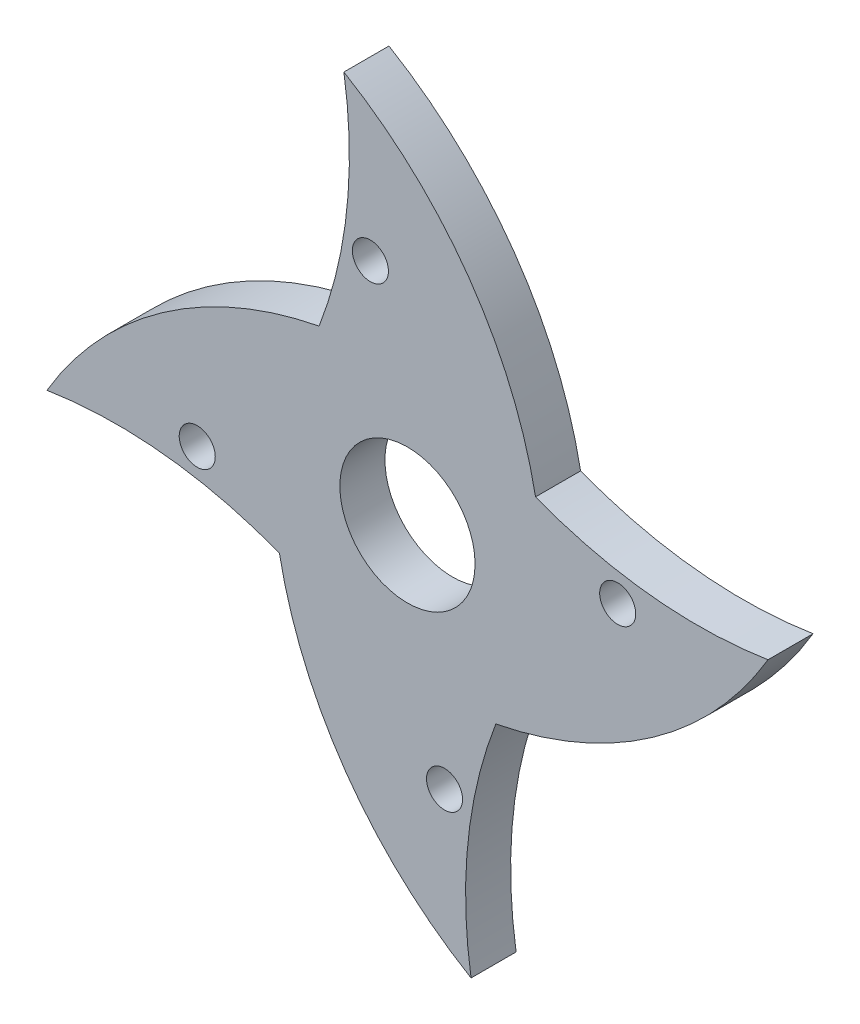
ISO-10303-21;
HEADER;
FILE_DESCRIPTION(('STEP AP214'),'2;1');
FILE_NAME('part.step','',(''),(''),'','','');
FILE_SCHEMA(('AUTOMOTIVE_DESIGN { 1 0 10303 214 1 1 1 1 }'));
ENDSEC;
DATA;
#1=APPLICATION_CONTEXT('core data for automotive mechanical design processes');
#2=APPLICATION_PROTOCOL_DEFINITION('international standard','automotive_design',2000,#1);
#3=PRODUCT_CONTEXT('',#1,'mechanical');
#4=PRODUCT('Part','Part','',(#3));
#5=PRODUCT_RELATED_PRODUCT_CATEGORY('part','',(#4));
#6=PRODUCT_DEFINITION_FORMATION('','',#4);
#7=PRODUCT_DEFINITION_CONTEXT('part definition',#1,'design');
#8=PRODUCT_DEFINITION('design','',#6,#7);
#9=PRODUCT_DEFINITION_SHAPE('','',#8);
#10=(LENGTH_UNIT() NAMED_UNIT(*) SI_UNIT(.MILLI.,.METRE.));
#11=(NAMED_UNIT(*) PLANE_ANGLE_UNIT() SI_UNIT($,.RADIAN.));
#12=(NAMED_UNIT(*) SI_UNIT($,.STERADIAN.) SOLID_ANGLE_UNIT());
#13=UNCERTAINTY_MEASURE_WITH_UNIT(LENGTH_MEASURE(1.E-05),#10,'distance_accuracy_value','');
#14=(GEOMETRIC_REPRESENTATION_CONTEXT(3) GLOBAL_UNCERTAINTY_ASSIGNED_CONTEXT((#13)) GLOBAL_UNIT_ASSIGNED_CONTEXT((#10,
#11,#12)) REPRESENTATION_CONTEXT('',''));
#15=CARTESIAN_POINT('',(0.,0.,0.));
#16=DIRECTION('',(0.,0.,1.));
#17=DIRECTION('',(1.,0.,0.));
#18=AXIS2_PLACEMENT_3D('',#15,#16,#17);
#19=CARTESIAN_POINT('',(-2.55003220114598,-59.9483059626185,10.));
#20=DIRECTION('',(0.,0.,-1.));
#21=DIRECTION('',(-1.,0.,0.));
#22=AXIS2_PLACEMENT_3D('',#19,#20,#21);
#23=CYLINDRICAL_SURFACE('',#22,90.0000000000019);
#24=CARTESIAN_POINT('',(-2.55003220114598,-59.9483059626185,0.));
#25=DIRECTION('',(0.,0.,1.));
#26=DIRECTION('',(1.,0.,0.));
#27=AXIS2_PLACEMENT_3D('',#24,#25,#26);
#28=CIRCLE('',#27,90.0000000000019);
#29=CARTESIAN_POINT('',(-80.0000000000034,-14.1061584566794,0.));
#30=VERTEX_POINT('',#29);
#31=CARTESIAN_POINT('',(-19.61,28.42,0.));
#32=VERTEX_POINT('',#31);
#33=EDGE_CURVE('E146',#30,#32,#28,.F.);
#34=ORIENTED_EDGE('',*,*,#33,.F.);
#35=DIRECTION('',(0.,0.,-1.));
#36=VECTOR('',#35,1.);
#37=CARTESIAN_POINT('',(-80.0000000000034,-14.1061584566794,10.));
#38=LINE('',#37,#36);
#39=CARTESIAN_POINT('',(-80.0000000000034,-14.1061584566794,10.));
#40=VERTEX_POINT('',#39);
#41=EDGE_CURVE('E11',#40,#30,#38,.T.);
#42=ORIENTED_EDGE('',*,*,#41,.F.);
#43=CARTESIAN_POINT('',(-2.55003220114598,-59.9483059626185,10.));
#44=DIRECTION('',(0.,0.,1.));
#45=DIRECTION('',(1.,0.,0.));
#46=AXIS2_PLACEMENT_3D('',#43,#44,#45);
#47=CIRCLE('',#46,90.0000000000019);
#48=CARTESIAN_POINT('',(-19.61,28.42,10.));
#49=VERTEX_POINT('',#48);
#50=EDGE_CURVE('E199',#40,#49,#47,.F.);
#51=ORIENTED_EDGE('',*,*,#50,.T.);
#52=DIRECTION('',(0.,0.,-1.));
#53=VECTOR('',#52,1.);
#54=CARTESIAN_POINT('',(-19.61,28.42,10.));
#55=LINE('',#54,#53);
#56=EDGE_CURVE('E87',#49,#32,#55,.T.);
#57=ORIENTED_EDGE('',*,*,#56,.T.);
#58=EDGE_LOOP('',(#34,#42,#51,#57));
#59=FACE_BOUND('',#58,.T.);
#60=ADVANCED_FACE('F36',(#59),#23,.T.);
#61=CARTESIAN_POINT('',(-64.4571752889624,-112.890876910508,10.));
#62=DIRECTION('',(0.,0.,-1.));
#63=DIRECTION('',(-1.,0.,0.));
#64=AXIS2_PLACEMENT_3D('',#61,#62,#63);
#65=CYLINDRICAL_SURFACE('',#64,99.9999999999988);
#66=CARTESIAN_POINT('',(-64.4571752889624,-112.890876910508,0.));
#67=DIRECTION('',(0.,0.,1.));
#68=DIRECTION('',(1.,0.,0.));
#69=AXIS2_PLACEMENT_3D('',#66,#67,#68);
#70=CIRCLE('',#69,99.9999999999988);
#71=CARTESIAN_POINT('',(-28.4200000000007,-19.6100000000053,0.));
#72=VERTEX_POINT('',#71);
#73=EDGE_CURVE('E149',#30,#72,#70,.F.);
#74=ORIENTED_EDGE('',*,*,#73,.T.);
#75=DIRECTION('',(0.,0.,-1.));
#76=VECTOR('',#75,1.);
#77=CARTESIAN_POINT('',(-28.4200000000007,-19.6100000000053,10.));
#78=LINE('',#77,#76);
#79=CARTESIAN_POINT('',(-28.4200000000007,-19.6100000000053,10.));
#80=VERTEX_POINT('',#79);
#81=EDGE_CURVE('E45',#80,#72,#78,.T.);
#82=ORIENTED_EDGE('',*,*,#81,.F.);
#83=CARTESIAN_POINT('',(-64.4571752889624,-112.890876910508,10.));
#84=DIRECTION('',(0.,0.,1.));
#85=DIRECTION('',(1.,0.,0.));
#86=AXIS2_PLACEMENT_3D('',#83,#84,#85);
#87=CIRCLE('',#86,99.9999999999988);
#88=EDGE_CURVE('E197',#40,#80,#87,.F.);
#89=ORIENTED_EDGE('',*,*,#88,.F.);
#90=ORIENTED_EDGE('',*,*,#41,.T.);
#91=EDGE_LOOP('',(#74,#82,#89,#90));
#92=FACE_BOUND('',#91,.T.);
#93=ADVANCED_FACE('F185',(#92),#65,.F.);
#94=CARTESIAN_POINT('',(59.9483059626154,-2.55003220115169,10.));
#95=DIRECTION('',(0.,0.,-1.));
#96=DIRECTION('',(-1.,0.,0.));
#97=AXIS2_PLACEMENT_3D('',#94,#95,#96);
#98=CYLINDRICAL_SURFACE('',#97,90.0000000000025);
#99=CARTESIAN_POINT('',(59.9483059626154,-2.55003220115169,0.));
#100=DIRECTION('',(0.,0.,1.));
#101=DIRECTION('',(1.,0.,0.));
#102=AXIS2_PLACEMENT_3D('',#99,#100,#101);
#103=CIRCLE('',#102,90.0000000000025);
#104=CARTESIAN_POINT('',(14.1061584566783,-80.000000000011,0.));
#105=VERTEX_POINT('',#104);
#106=EDGE_CURVE('E152',#105,#72,#103,.F.);
#107=ORIENTED_EDGE('',*,*,#106,.F.);
#108=DIRECTION('',(0.,0.,-1.));
#109=VECTOR('',#108,1.);
#110=CARTESIAN_POINT('',(14.1061584566783,-80.000000000011,10.));
#111=LINE('',#110,#109);
#112=CARTESIAN_POINT('',(14.1061584566783,-80.000000000011,10.));
#113=VERTEX_POINT('',#112);
#114=EDGE_CURVE('E175',#113,#105,#111,.T.);
#115=ORIENTED_EDGE('',*,*,#114,.F.);
#116=CARTESIAN_POINT('',(59.9483059626154,-2.55003220115169,10.));
#117=DIRECTION('',(0.,0.,1.));
#118=DIRECTION('',(1.,0.,0.));
#119=AXIS2_PLACEMENT_3D('',#116,#117,#118);
#120=CIRCLE('',#119,90.0000000000025);
#121=EDGE_CURVE('E182',#113,#80,#120,.F.);
#122=ORIENTED_EDGE('',*,*,#121,.T.);
#123=ORIENTED_EDGE('',*,*,#81,.T.);
#124=EDGE_LOOP('',(#107,#115,#122,#123));
#125=FACE_BOUND('',#124,.T.);
#126=ADVANCED_FACE('F180',(#125),#98,.T.);
#127=CARTESIAN_POINT('',(112.890876910507,-64.4571752889705,10.));
#128=DIRECTION('',(0.,0.,-1.));
#129=DIRECTION('',(-1.,0.,0.));
#130=AXIS2_PLACEMENT_3D('',#127,#128,#129);
#131=CYLINDRICAL_SURFACE('',#130,100.000000000003);
#132=CARTESIAN_POINT('',(112.890876910507,-64.4571752889705,0.));
#133=DIRECTION('',(0.,0.,1.));
#134=DIRECTION('',(1.,0.,0.));
#135=AXIS2_PLACEMENT_3D('',#132,#133,#134);
#136=CIRCLE('',#135,100.000000000003);
#137=CARTESIAN_POINT('',(19.6100000000004,-28.420000000002,0.));
#138=VERTEX_POINT('',#137);
#139=EDGE_CURVE('E155',#105,#138,#136,.F.);
#140=ORIENTED_EDGE('',*,*,#139,.T.);
#141=DIRECTION('',(0.,0.,-1.));
#142=VECTOR('',#141,1.);
#143=CARTESIAN_POINT('',(19.6100000000004,-28.420000000002,10.));
#144=LINE('',#143,#142);
#145=CARTESIAN_POINT('',(19.6100000000004,-28.420000000002,10.));
#146=VERTEX_POINT('',#145);
#147=EDGE_CURVE('E173',#146,#138,#144,.T.);
#148=ORIENTED_EDGE('',*,*,#147,.F.);
#149=CARTESIAN_POINT('',(112.890876910507,-64.4571752889705,10.));
#150=DIRECTION('',(0.,0.,1.));
#151=DIRECTION('',(1.,0.,0.));
#152=AXIS2_PLACEMENT_3D('',#149,#150,#151);
#153=CIRCLE('',#152,100.000000000003);
#154=EDGE_CURVE('E195',#113,#146,#153,.F.);
#155=ORIENTED_EDGE('',*,*,#154,.F.);
#156=ORIENTED_EDGE('',*,*,#114,.T.);
#157=EDGE_LOOP('',(#140,#148,#155,#156));
#158=FACE_BOUND('',#157,.T.);
#159=ADVANCED_FACE('F193',(#158),#131,.F.);
#160=CARTESIAN_POINT('',(2.55003220114852,59.9483059626096,10.));
#161=DIRECTION('',(0.,0.,-1.));
#162=DIRECTION('',(-1.,0.,0.));
#163=AXIS2_PLACEMENT_3D('',#160,#161,#162);
#164=CYLINDRICAL_SURFACE('',#163,89.9999999999979);
#165=CARTESIAN_POINT('',(2.55003220114852,59.9483059626096,0.));
#166=DIRECTION('',(0.,0.,1.));
#167=DIRECTION('',(1.,0.,0.));
#168=AXIS2_PLACEMENT_3D('',#165,#166,#167);
#169=CIRCLE('',#168,89.9999999999979);
#170=CARTESIAN_POINT('',(80.0000000000039,14.1061584566749,0.));
#171=VERTEX_POINT('',#170);
#172=EDGE_CURVE('E158',#171,#138,#169,.F.);
#173=ORIENTED_EDGE('',*,*,#172,.F.);
#174=DIRECTION('',(0.,0.,-1.));
#175=VECTOR('',#174,1.);
#176=CARTESIAN_POINT('',(80.0000000000039,14.1061584566749,10.));
#177=LINE('',#176,#175);
#178=CARTESIAN_POINT('',(80.0000000000039,14.1061584566749,10.));
#179=VERTEX_POINT('',#178);
#180=EDGE_CURVE('E124',#179,#171,#177,.T.);
#181=ORIENTED_EDGE('',*,*,#180,.F.);
#182=CARTESIAN_POINT('',(2.55003220114852,59.9483059626096,10.));
#183=DIRECTION('',(0.,0.,1.));
#184=DIRECTION('',(1.,0.,0.));
#185=AXIS2_PLACEMENT_3D('',#182,#183,#184);
#186=CIRCLE('',#185,89.9999999999979);
#187=EDGE_CURVE('E113',#179,#146,#186,.F.);
#188=ORIENTED_EDGE('',*,*,#187,.T.);
#189=ORIENTED_EDGE('',*,*,#147,.T.);
#190=EDGE_LOOP('',(#173,#181,#188,#189));
#191=FACE_BOUND('',#190,.T.);
#192=ADVANCED_FACE('F203',(#191),#164,.T.);
#193=CARTESIAN_POINT('',(64.4571752889649,112.890876910499,10.));
#194=DIRECTION('',(0.,0.,-1.));
#195=DIRECTION('',(-1.,0.,0.));
#196=AXIS2_PLACEMENT_3D('',#193,#194,#195);
#197=CYLINDRICAL_SURFACE('',#196,99.9999999999977);
#198=CARTESIAN_POINT('',(64.4571752889649,112.890876910499,0.));
#199=DIRECTION('',(0.,0.,1.));
#200=DIRECTION('',(1.,0.,0.));
#201=AXIS2_PLACEMENT_3D('',#198,#199,#200);
#202=CIRCLE('',#201,99.9999999999977);
#203=CARTESIAN_POINT('',(28.42,19.61,0.));
#204=VERTEX_POINT('',#203);
#205=EDGE_CURVE('E120',#171,#204,#202,.F.);
#206=ORIENTED_EDGE('',*,*,#205,.T.);
#207=DIRECTION('',(0.,0.,-1.));
#208=VECTOR('',#207,1.);
#209=CARTESIAN_POINT('',(28.42,19.61,10.));
#210=LINE('',#209,#208);
#211=CARTESIAN_POINT('',(28.42,19.61,10.));
#212=VERTEX_POINT('',#211);
#213=EDGE_CURVE('E117',#212,#204,#210,.T.);
#214=ORIENTED_EDGE('',*,*,#213,.F.);
#215=CARTESIAN_POINT('',(64.4571752889649,112.890876910499,10.));
#216=DIRECTION('',(0.,0.,1.));
#217=DIRECTION('',(1.,0.,0.));
#218=AXIS2_PLACEMENT_3D('',#215,#216,#217);
#219=CIRCLE('',#218,99.9999999999977);
#220=EDGE_CURVE('E106',#179,#212,#219,.F.);
#221=ORIENTED_EDGE('',*,*,#220,.F.);
#222=ORIENTED_EDGE('',*,*,#180,.T.);
#223=EDGE_LOOP('',(#206,#214,#221,#222));
#224=FACE_BOUND('',#223,.T.);
#225=ADVANCED_FACE('F118',(#224),#197,.F.);
#226=CARTESIAN_POINT('',(-59.9483059626128,2.5500322011428,10.));
#227=DIRECTION('',(0.,0.,-1.));
#228=DIRECTION('',(-1.,0.,0.));
#229=AXIS2_PLACEMENT_3D('',#226,#227,#228);
#230=CYLINDRICAL_SURFACE('',#229,90.);
#231=CARTESIAN_POINT('',(-59.9483059626128,2.5500322011428,0.));
#232=DIRECTION('',(0.,0.,1.));
#233=DIRECTION('',(1.,0.,0.));
#234=AXIS2_PLACEMENT_3D('',#231,#232,#233);
#235=CIRCLE('',#234,90.);
#236=CARTESIAN_POINT('',(-14.106158456677,80.,0.));
#237=VERTEX_POINT('',#236);
#238=EDGE_CURVE('E162',#237,#204,#235,.F.);
#239=ORIENTED_EDGE('',*,*,#238,.F.);
#240=DIRECTION('',(0.,0.,-1.));
#241=VECTOR('',#240,1.);
#242=CARTESIAN_POINT('',(-14.106158456677,80.,10.));
#243=LINE('',#242,#241);
#244=CARTESIAN_POINT('',(-14.106158456677,80.,10.));
#245=VERTEX_POINT('',#244);
#246=EDGE_CURVE('E80',#245,#237,#243,.T.);
#247=ORIENTED_EDGE('',*,*,#246,.F.);
#248=CARTESIAN_POINT('',(-59.9483059626128,2.5500322011428,10.));
#249=DIRECTION('',(0.,0.,1.));
#250=DIRECTION('',(1.,0.,0.));
#251=AXIS2_PLACEMENT_3D('',#248,#249,#250);
#252=CIRCLE('',#251,90.);
#253=EDGE_CURVE('E111',#245,#212,#252,.F.);
#254=ORIENTED_EDGE('',*,*,#253,.T.);
#255=ORIENTED_EDGE('',*,*,#213,.T.);
#256=EDGE_LOOP('',(#239,#247,#254,#255));
#257=FACE_BOUND('',#256,.T.);
#258=ADVANCED_FACE('F126',(#257),#230,.T.);
#259=CARTESIAN_POINT('',(-112.890876910504,64.4571752889616,10.));
#260=DIRECTION('',(0.,0.,-1.));
#261=DIRECTION('',(-1.,0.,0.));
#262=AXIS2_PLACEMENT_3D('',#259,#260,#261);
#263=CYLINDRICAL_SURFACE('',#262,100.);
#264=CARTESIAN_POINT('',(-112.890876910504,64.4571752889616,0.));
#265=DIRECTION('',(0.,0.,1.));
#266=DIRECTION('',(1.,0.,0.));
#267=AXIS2_PLACEMENT_3D('',#264,#265,#266);
#268=CIRCLE('',#267,100.);
#269=EDGE_CURVE('E164',#237,#32,#268,.F.);
#270=ORIENTED_EDGE('',*,*,#269,.T.);
#271=ORIENTED_EDGE('',*,*,#56,.F.);
#272=CARTESIAN_POINT('',(-112.890876910504,64.4571752889616,10.));
#273=DIRECTION('',(0.,0.,1.));
#274=DIRECTION('',(1.,0.,0.));
#275=AXIS2_PLACEMENT_3D('',#272,#273,#274);
#276=CIRCLE('',#275,100.);
#277=EDGE_CURVE('E53',#245,#49,#276,.F.);
#278=ORIENTED_EDGE('',*,*,#277,.F.);
#279=ORIENTED_EDGE('',*,*,#246,.T.);
#280=EDGE_LOOP('',(#270,#271,#278,#279));
#281=FACE_BOUND('',#280,.T.);
#282=ADVANCED_FACE('F204',(#281),#263,.F.);
#283=CARTESIAN_POINT('',(8.22565365005229,-46.6500000000089,10.));
#284=DIRECTION('',(0.,0.,-1.));
#285=DIRECTION('',(-1.,0.,0.));
#286=AXIS2_PLACEMENT_3D('',#283,#284,#285);
#287=CYLINDRICAL_SURFACE('',#286,4.00000000000016);
#288=CARTESIAN_POINT('',(8.22565365005229,-46.6500000000089,10.));
#289=DIRECTION('',(0.,0.,1.));
#290=DIRECTION('',(1.,0.,0.));
#291=AXIS2_PLACEMENT_3D('',#288,#289,#290);
#292=CIRCLE('',#291,4.00000000000016);
#293=CARTESIAN_POINT('',(12.2256536500524,-46.6500000000089,10.));
#294=VERTEX_POINT('',#293);
#295=EDGE_CURVE('E205',#294,#294,#292,.T.);
#296=ORIENTED_EDGE('',*,*,#295,.T.);
#297=EDGE_LOOP('',(#296));
#298=FACE_BOUND('',#297,.T.);
#299=CARTESIAN_POINT('',(8.22565365005229,-46.6500000000089,0.));
#300=DIRECTION('',(0.,0.,1.));
#301=DIRECTION('',(1.,0.,0.));
#302=AXIS2_PLACEMENT_3D('',#299,#300,#301);
#303=CIRCLE('',#302,4.00000000000016);
#304=CARTESIAN_POINT('',(12.2256536500524,-46.6500000000089,0.));
#305=VERTEX_POINT('',#304);
#306=EDGE_CURVE('E143',#305,#305,#303,.T.);
#307=ORIENTED_EDGE('',*,*,#306,.F.);
#308=EDGE_LOOP('',(#307));
#309=FACE_BOUND('',#308,.T.);
#310=ADVANCED_FACE('F230',(#298,#309),#287,.F.);
#311=CARTESIAN_POINT('',(46.6500000000057,8.22565365004658,10.));
#312=DIRECTION('',(0.,0.,-1.));
#313=DIRECTION('',(-1.,0.,0.));
#314=AXIS2_PLACEMENT_3D('',#311,#312,#313);
#315=CYLINDRICAL_SURFACE('',#314,3.99999999999547);
#316=CARTESIAN_POINT('',(46.6500000000057,8.22565365004658,10.));
#317=DIRECTION('',(0.,0.,1.));
#318=DIRECTION('',(1.,0.,0.));
#319=AXIS2_PLACEMENT_3D('',#316,#317,#318);
#320=CIRCLE('',#319,3.99999999999547);
#321=CARTESIAN_POINT('',(50.6500000000012,8.22565365004658,10.));
#322=VERTEX_POINT('',#321);
#323=EDGE_CURVE('E207',#322,#322,#320,.T.);
#324=ORIENTED_EDGE('',*,*,#323,.T.);
#325=EDGE_LOOP('',(#324));
#326=FACE_BOUND('',#325,.T.);
#327=CARTESIAN_POINT('',(46.6500000000057,8.22565365004658,0.));
#328=DIRECTION('',(0.,0.,1.));
#329=DIRECTION('',(1.,0.,0.));
#330=AXIS2_PLACEMENT_3D('',#327,#328,#329);
#331=CIRCLE('',#330,3.99999999999547);
#332=CARTESIAN_POINT('',(50.6500000000012,8.22565365004658,0.));
#333=VERTEX_POINT('',#332);
#334=EDGE_CURVE('E140',#333,#333,#331,.T.);
#335=ORIENTED_EDGE('',*,*,#334,.F.);
#336=EDGE_LOOP('',(#335));
#337=FACE_BOUND('',#336,.T.);
#338=ADVANCED_FACE('F233',(#326,#337),#315,.F.);
#339=CARTESIAN_POINT('',(-8.22565365004975,46.65,10.));
#340=DIRECTION('',(0.,0.,-1.));
#341=DIRECTION('',(-1.,0.,0.));
#342=AXIS2_PLACEMENT_3D('',#339,#340,#341);
#343=CYLINDRICAL_SURFACE('',#342,4.);
#344=CARTESIAN_POINT('',(-8.22565365004975,46.65,10.));
#345=DIRECTION('',(0.,0.,1.));
#346=DIRECTION('',(1.,0.,0.));
#347=AXIS2_PLACEMENT_3D('',#344,#345,#346);
#348=CIRCLE('',#347,4.);
#349=CARTESIAN_POINT('',(-4.22565365004975,46.65,10.));
#350=VERTEX_POINT('',#349);
#351=EDGE_CURVE('E212',#350,#350,#348,.T.);
#352=ORIENTED_EDGE('',*,*,#351,.T.);
#353=EDGE_LOOP('',(#352));
#354=FACE_BOUND('',#353,.T.);
#355=CARTESIAN_POINT('',(-8.22565365004975,46.65,0.));
#356=DIRECTION('',(0.,0.,1.));
#357=DIRECTION('',(1.,0.,0.));
#358=AXIS2_PLACEMENT_3D('',#355,#356,#357);
#359=CIRCLE('',#358,4.);
#360=CARTESIAN_POINT('',(-4.22565365004975,46.65,0.));
#361=VERTEX_POINT('',#360);
#362=EDGE_CURVE('E137',#361,#361,#359,.T.);
#363=ORIENTED_EDGE('',*,*,#362,.F.);
#364=EDGE_LOOP('',(#363));
#365=FACE_BOUND('',#364,.T.);
#366=ADVANCED_FACE('F253',(#354,#365),#343,.F.);
#367=CARTESIAN_POINT('',(-46.6500000000032,-8.22565365005546,10.));
#368=DIRECTION('',(0.,0.,-1.));
#369=DIRECTION('',(-1.,0.,0.));
#370=AXIS2_PLACEMENT_3D('',#367,#368,#369);
#371=CYLINDRICAL_SURFACE('',#370,4.00000000000503);
#372=CARTESIAN_POINT('',(-46.6500000000032,-8.22565365005546,10.));
#373=DIRECTION('',(0.,0.,1.));
#374=DIRECTION('',(1.,0.,0.));
#375=AXIS2_PLACEMENT_3D('',#372,#373,#374);
#376=CIRCLE('',#375,4.00000000000503);
#377=CARTESIAN_POINT('',(-42.6499999999981,-8.22565365005546,10.));
#378=VERTEX_POINT('',#377);
#379=EDGE_CURVE('E169',#378,#378,#376,.T.);
#380=ORIENTED_EDGE('',*,*,#379,.T.);
#381=EDGE_LOOP('',(#380));
#382=FACE_BOUND('',#381,.T.);
#383=CARTESIAN_POINT('',(-46.6500000000032,-8.22565365005546,0.));
#384=DIRECTION('',(0.,0.,1.));
#385=DIRECTION('',(1.,0.,0.));
#386=AXIS2_PLACEMENT_3D('',#383,#384,#385);
#387=CIRCLE('',#386,4.00000000000503);
#388=CARTESIAN_POINT('',(-42.6499999999981,-8.22565365005546,0.));
#389=VERTEX_POINT('',#388);
#390=EDGE_CURVE('E134',#389,#389,#387,.T.);
#391=ORIENTED_EDGE('',*,*,#390,.F.);
#392=EDGE_LOOP('',(#391));
#393=FACE_BOUND('',#392,.T.);
#394=ADVANCED_FACE('F38',(#382,#393),#371,.F.);
#395=CARTESIAN_POINT('',(0.,0.,10.));
#396=DIRECTION('',(0.,0.,-1.));
#397=DIRECTION('',(-1.,0.,0.));
#398=AXIS2_PLACEMENT_3D('',#395,#396,#397);
#399=CYLINDRICAL_SURFACE('',#398,15.);
#400=CARTESIAN_POINT('',(0.,0.,10.));
#401=DIRECTION('',(0.,0.,1.));
#402=DIRECTION('',(1.,0.,0.));
#403=AXIS2_PLACEMENT_3D('',#400,#401,#402);
#404=CIRCLE('',#403,15.);
#405=CARTESIAN_POINT('',(15.,0.,10.));
#406=VERTEX_POINT('',#405);
#407=EDGE_CURVE('E128',#406,#406,#404,.T.);
#408=ORIENTED_EDGE('',*,*,#407,.T.);
#409=EDGE_LOOP('',(#408));
#410=FACE_BOUND('',#409,.T.);
#411=CARTESIAN_POINT('',(0.,0.,0.));
#412=DIRECTION('',(0.,0.,1.));
#413=DIRECTION('',(1.,0.,0.));
#414=AXIS2_PLACEMENT_3D('',#411,#412,#413);
#415=CIRCLE('',#414,15.);
#416=CARTESIAN_POINT('',(15.,0.,0.));
#417=VERTEX_POINT('',#416);
#418=EDGE_CURVE('E166',#417,#417,#415,.T.);
#419=ORIENTED_EDGE('',*,*,#418,.F.);
#420=EDGE_LOOP('',(#419));
#421=FACE_BOUND('',#420,.T.);
#422=ADVANCED_FACE('F222',(#410,#421),#399,.F.);
#423=CARTESIAN_POINT('',(0.,0.,10.));
#424=DIRECTION('',(0.,0.,1.));
#425=DIRECTION('',(1.,0.,0.));
#426=AXIS2_PLACEMENT_3D('',#423,#424,#425);
#427=PLANE('',#426);
#428=ORIENTED_EDGE('',*,*,#379,.F.);
#429=EDGE_LOOP('',(#428));
#430=FACE_BOUND('',#429,.T.);
#431=ORIENTED_EDGE('',*,*,#351,.F.);
#432=EDGE_LOOP('',(#431));
#433=FACE_BOUND('',#432,.T.);
#434=ORIENTED_EDGE('',*,*,#323,.F.);
#435=EDGE_LOOP('',(#434));
#436=FACE_BOUND('',#435,.T.);
#437=ORIENTED_EDGE('',*,*,#295,.F.);
#438=EDGE_LOOP('',(#437));
#439=FACE_BOUND('',#438,.T.);
#440=ORIENTED_EDGE('',*,*,#50,.F.);
#441=ORIENTED_EDGE('',*,*,#88,.T.);
#442=ORIENTED_EDGE('',*,*,#121,.F.);
#443=ORIENTED_EDGE('',*,*,#154,.T.);
#444=ORIENTED_EDGE('',*,*,#187,.F.);
#445=ORIENTED_EDGE('',*,*,#220,.T.);
#446=ORIENTED_EDGE('',*,*,#253,.F.);
#447=ORIENTED_EDGE('',*,*,#277,.T.);
#448=EDGE_LOOP('',(#440,#441,#442,#443,#444,#445,#446,#447));
#449=FACE_BOUND('',#448,.T.);
#450=ORIENTED_EDGE('',*,*,#407,.F.);
#451=EDGE_LOOP('',(#450));
#452=FACE_BOUND('',#451,.T.);
#453=ADVANCED_FACE('F108',(#430,#433,#436,#439,#449,#452),#427,.T.);
#454=CARTESIAN_POINT('',(0.,0.,0.));
#455=DIRECTION('',(0.,0.,1.));
#456=DIRECTION('',(1.,0.,0.));
#457=AXIS2_PLACEMENT_3D('',#454,#455,#456);
#458=PLANE('',#457);
#459=ORIENTED_EDGE('',*,*,#390,.T.);
#460=EDGE_LOOP('',(#459));
#461=FACE_BOUND('',#460,.T.);
#462=ORIENTED_EDGE('',*,*,#362,.T.);
#463=EDGE_LOOP('',(#462));
#464=FACE_BOUND('',#463,.T.);
#465=ORIENTED_EDGE('',*,*,#334,.T.);
#466=EDGE_LOOP('',(#465));
#467=FACE_BOUND('',#466,.T.);
#468=ORIENTED_EDGE('',*,*,#306,.T.);
#469=EDGE_LOOP('',(#468));
#470=FACE_BOUND('',#469,.T.);
#471=ORIENTED_EDGE('',*,*,#33,.T.);
#472=ORIENTED_EDGE('',*,*,#269,.F.);
#473=ORIENTED_EDGE('',*,*,#238,.T.);
#474=ORIENTED_EDGE('',*,*,#205,.F.);
#475=ORIENTED_EDGE('',*,*,#172,.T.);
#476=ORIENTED_EDGE('',*,*,#139,.F.);
#477=ORIENTED_EDGE('',*,*,#106,.T.);
#478=ORIENTED_EDGE('',*,*,#73,.F.);
#479=EDGE_LOOP('',(#471,#472,#473,#474,#475,#476,#477,#478));
#480=FACE_BOUND('',#479,.T.);
#481=ORIENTED_EDGE('',*,*,#418,.T.);
#482=EDGE_LOOP('',(#481));
#483=FACE_BOUND('',#482,.T.);
#484=ADVANCED_FACE('F188',(#461,#464,#467,#470,#480,#483),#458,.F.);
#485=CLOSED_SHELL('',(#60,#93,#126,#159,#192,#225,#258,#282,#310,#338,#366,#394,#422,#453,#484));
#486=MANIFOLD_SOLID_BREP('B2',#485);
#487=ADVANCED_BREP_SHAPE_REPRESENTATION('',(#18,#486),#14);
#488=SHAPE_DEFINITION_REPRESENTATION(#9,#487);
ENDSEC;
END-ISO-10303-21;
